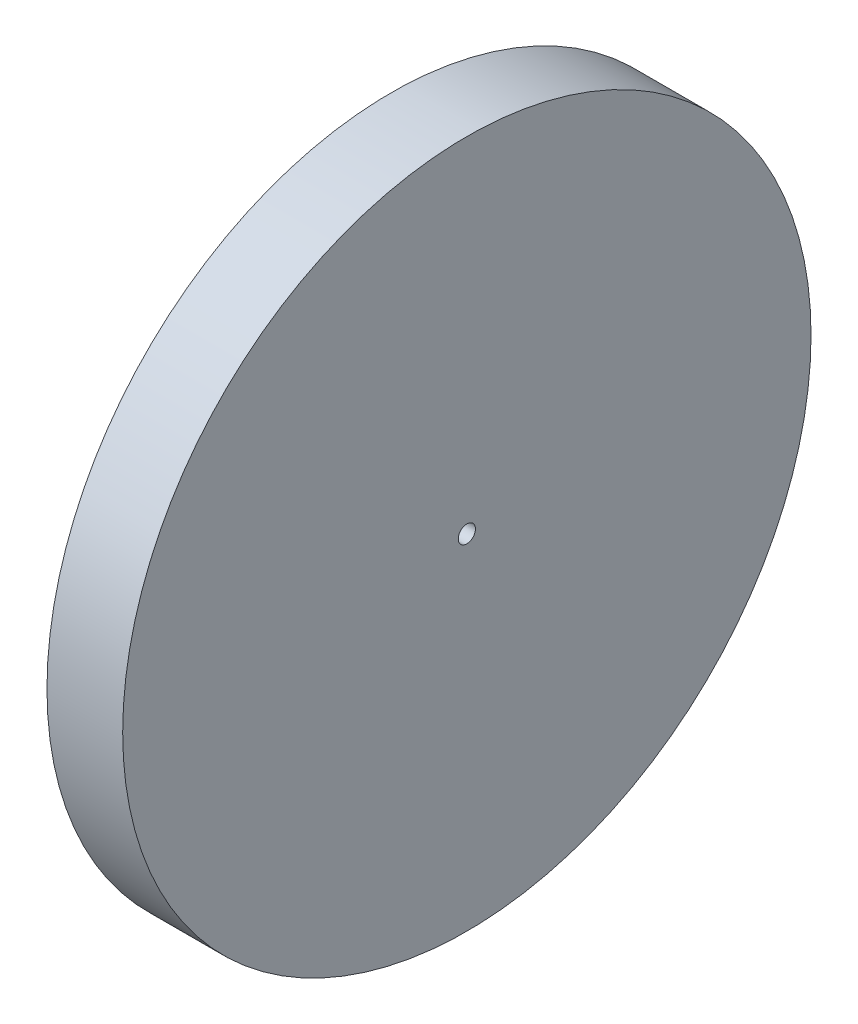
ISO-10303-21;
HEADER;
FILE_DESCRIPTION(('STEP AP214'),'2;1');
FILE_NAME('part.step','',(''),(''),'','','');
FILE_SCHEMA(('AUTOMOTIVE_DESIGN { 1 0 10303 214 1 1 1 1 }'));
ENDSEC;
DATA;
#1=APPLICATION_CONTEXT('core data for automotive mechanical design processes');
#2=APPLICATION_PROTOCOL_DEFINITION('international standard','automotive_design',2000,#1);
#3=PRODUCT_CONTEXT('',#1,'mechanical');
#4=PRODUCT('Part','Part','',(#3));
#5=PRODUCT_RELATED_PRODUCT_CATEGORY('part','',(#4));
#6=PRODUCT_DEFINITION_FORMATION('','',#4);
#7=PRODUCT_DEFINITION_CONTEXT('part definition',#1,'design');
#8=PRODUCT_DEFINITION('design','',#6,#7);
#9=PRODUCT_DEFINITION_SHAPE('','',#8);
#10=(LENGTH_UNIT() NAMED_UNIT(*) SI_UNIT(.MILLI.,.METRE.));
#11=(NAMED_UNIT(*) PLANE_ANGLE_UNIT() SI_UNIT($,.RADIAN.));
#12=(NAMED_UNIT(*) SI_UNIT($,.STERADIAN.) SOLID_ANGLE_UNIT());
#13=UNCERTAINTY_MEASURE_WITH_UNIT(LENGTH_MEASURE(1.E-05),#10,'distance_accuracy_value','');
#14=(GEOMETRIC_REPRESENTATION_CONTEXT(3) GLOBAL_UNCERTAINTY_ASSIGNED_CONTEXT((#13)) GLOBAL_UNIT_ASSIGNED_CONTEXT((#10,
#11,#12)) REPRESENTATION_CONTEXT('',''));
#15=CARTESIAN_POINT('',(0.,0.,0.));
#16=DIRECTION('',(0.,0.,1.));
#17=DIRECTION('',(1.,0.,0.));
#18=AXIS2_PLACEMENT_3D('',#15,#16,#17);
#19=CARTESIAN_POINT('',(22.,0.,0.));
#20=DIRECTION('',(-1.,0.,0.));
#21=DIRECTION('',(0.,0.,1.));
#22=AXIS2_PLACEMENT_3D('',#19,#20,#21);
#23=CYLINDRICAL_SURFACE('',#22,100.);
#24=CARTESIAN_POINT('',(22.,0.,0.));
#25=DIRECTION('',(1.,0.,0.));
#26=DIRECTION('',(0.,0.,-1.));
#27=AXIS2_PLACEMENT_3D('',#24,#25,#26);
#28=CIRCLE('',#27,100.);
#29=CARTESIAN_POINT('',(22.,0.,-100.));
#30=VERTEX_POINT('',#29);
#31=EDGE_CURVE('E10',#30,#30,#28,.T.);
#32=ORIENTED_EDGE('',*,*,#31,.F.);
#33=EDGE_LOOP('',(#32));
#34=FACE_BOUND('',#33,.T.);
#35=CARTESIAN_POINT('',(0.,0.,0.));
#36=DIRECTION('',(1.,0.,0.));
#37=DIRECTION('',(0.,0.,-1.));
#38=AXIS2_PLACEMENT_3D('',#35,#36,#37);
#39=CIRCLE('',#38,100.);
#40=CARTESIAN_POINT('',(0.,0.,-100.));
#41=VERTEX_POINT('',#40);
#42=EDGE_CURVE('E34',#41,#41,#39,.T.);
#43=ORIENTED_EDGE('',*,*,#42,.T.);
#44=EDGE_LOOP('',(#43));
#45=FACE_BOUND('',#44,.T.);
#46=ADVANCED_FACE('F31',(#34,#45),#23,.T.);
#47=CARTESIAN_POINT('',(22.,0.,0.));
#48=DIRECTION('',(1.,0.,0.));
#49=DIRECTION('',(0.,0.,-1.));
#50=AXIS2_PLACEMENT_3D('',#47,#48,#49);
#51=PLANE('',#50);
#52=CARTESIAN_POINT('',(22.,0.,0.));
#53=DIRECTION('',(1.,0.,0.));
#54=DIRECTION('',(0.,0.,-1.));
#55=AXIS2_PLACEMENT_3D('',#52,#53,#54);
#56=CIRCLE('',#55,2.5);
#57=CARTESIAN_POINT('',(22.,0.,-2.5));
#58=VERTEX_POINT('',#57);
#59=EDGE_CURVE('E43',#58,#58,#56,.T.);
#60=ORIENTED_EDGE('',*,*,#59,.F.);
#61=EDGE_LOOP('',(#60));
#62=FACE_BOUND('',#61,.T.);
#63=ORIENTED_EDGE('',*,*,#31,.T.);
#64=EDGE_LOOP('',(#63));
#65=FACE_BOUND('',#64,.T.);
#66=ADVANCED_FACE('F58',(#62,#65),#51,.T.);
#67=CARTESIAN_POINT('',(0.,0.,0.));
#68=DIRECTION('',(1.,0.,0.));
#69=DIRECTION('',(0.,0.,-1.));
#70=AXIS2_PLACEMENT_3D('',#67,#68,#69);
#71=PLANE('',#70);
#72=CARTESIAN_POINT('',(0.,0.,0.));
#73=DIRECTION('',(1.,0.,0.));
#74=DIRECTION('',(0.,0.,-1.));
#75=AXIS2_PLACEMENT_3D('',#72,#73,#74);
#76=CIRCLE('',#75,2.5);
#77=CARTESIAN_POINT('',(0.,0.,-2.5));
#78=VERTEX_POINT('',#77);
#79=EDGE_CURVE('E41',#78,#78,#76,.T.);
#80=ORIENTED_EDGE('',*,*,#79,.T.);
#81=EDGE_LOOP('',(#80));
#82=FACE_BOUND('',#81,.T.);
#83=ORIENTED_EDGE('',*,*,#42,.F.);
#84=EDGE_LOOP('',(#83));
#85=FACE_BOUND('',#84,.T.);
#86=ADVANCED_FACE('F49',(#82,#85),#71,.F.);
#87=CARTESIAN_POINT('',(0.,0.,0.));
#88=DIRECTION('',(1.,0.,0.));
#89=DIRECTION('',(0.,0.,-1.));
#90=AXIS2_PLACEMENT_3D('',#87,#88,#89);
#91=CYLINDRICAL_SURFACE('',#90,2.5);
#92=ORIENTED_EDGE('',*,*,#79,.F.);
#93=EDGE_LOOP('',(#92));
#94=FACE_BOUND('',#93,.T.);
#95=ORIENTED_EDGE('',*,*,#59,.T.);
#96=EDGE_LOOP('',(#95));
#97=FACE_BOUND('',#96,.T.);
#98=ADVANCED_FACE('F52',(#94,#97),#91,.F.);
#99=CLOSED_SHELL('',(#46,#66,#86,#98));
#100=MANIFOLD_SOLID_BREP('B2',#99);
#101=ADVANCED_BREP_SHAPE_REPRESENTATION('',(#18,#100),#14);
#102=SHAPE_DEFINITION_REPRESENTATION(#9,#101);
ENDSEC;
END-ISO-10303-21;
